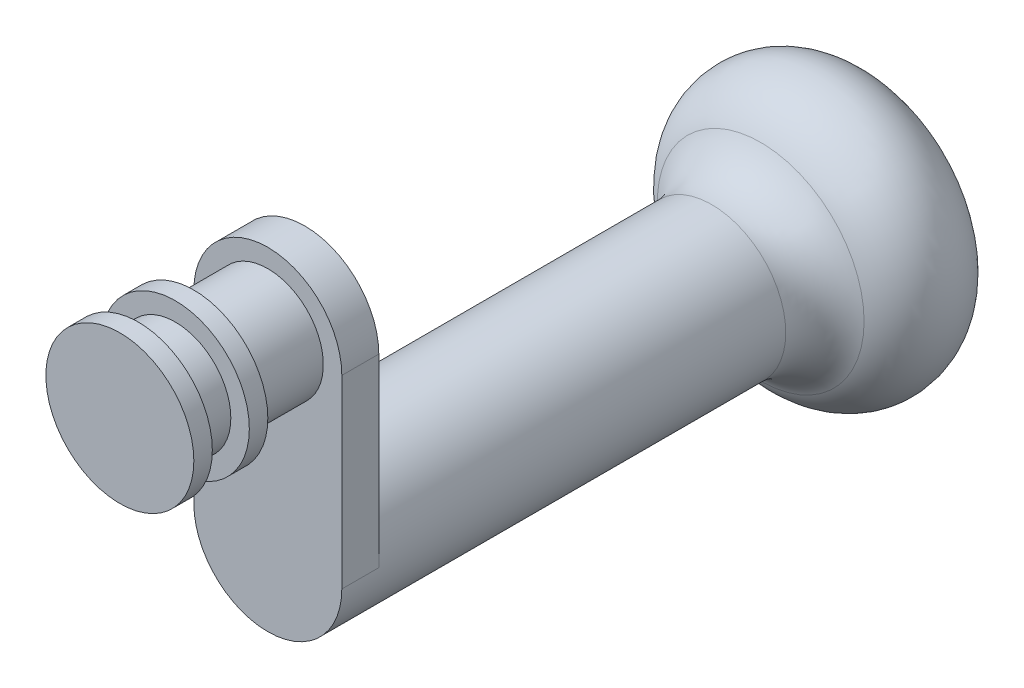
ISO-10303-21;
HEADER;
FILE_DESCRIPTION(('STEP AP214'),'2;1');
FILE_NAME('part.step','',(''),(''),'','','');
FILE_SCHEMA(('AUTOMOTIVE_DESIGN { 1 0 10303 214 1 1 1 1 }'));
ENDSEC;
DATA;
#1=APPLICATION_CONTEXT('core data for automotive mechanical design processes');
#2=APPLICATION_PROTOCOL_DEFINITION('international standard','automotive_design',2000,#1);
#3=PRODUCT_CONTEXT('',#1,'mechanical');
#4=PRODUCT('Part','Part','',(#3));
#5=PRODUCT_RELATED_PRODUCT_CATEGORY('part','',(#4));
#6=PRODUCT_DEFINITION_FORMATION('','',#4);
#7=PRODUCT_DEFINITION_CONTEXT('part definition',#1,'design');
#8=PRODUCT_DEFINITION('design','',#6,#7);
#9=PRODUCT_DEFINITION_SHAPE('','',#8);
#10=(LENGTH_UNIT() NAMED_UNIT(*) SI_UNIT(.MILLI.,.METRE.));
#11=(NAMED_UNIT(*) PLANE_ANGLE_UNIT() SI_UNIT($,.RADIAN.));
#12=(NAMED_UNIT(*) SI_UNIT($,.STERADIAN.) SOLID_ANGLE_UNIT());
#13=UNCERTAINTY_MEASURE_WITH_UNIT(LENGTH_MEASURE(1.E-05),#10,'distance_accuracy_value','');
#14=(GEOMETRIC_REPRESENTATION_CONTEXT(3) GLOBAL_UNCERTAINTY_ASSIGNED_CONTEXT((#13)) GLOBAL_UNIT_ASSIGNED_CONTEXT((#10,
#11,#12)) REPRESENTATION_CONTEXT('',''));
#15=CARTESIAN_POINT('',(0.,0.,0.));
#16=DIRECTION('',(0.,0.,1.));
#17=DIRECTION('',(1.,0.,0.));
#18=AXIS2_PLACEMENT_3D('',#15,#16,#17);
#19=CARTESIAN_POINT('',(0.,0.,25.));
#20=DIRECTION('',(0.,0.,-1.));
#21=DIRECTION('',(-1.,0.,0.));
#22=AXIS2_PLACEMENT_3D('',#19,#20,#21);
#23=CYLINDRICAL_SURFACE('',#22,7.5);
#24=CARTESIAN_POINT('',(0.,0.,15.));
#25=DIRECTION('',(0.,0.,1.));
#26=DIRECTION('',(1.,0.,0.));
#27=AXIS2_PLACEMENT_3D('',#24,#25,#26);
#28=CIRCLE('',#27,7.5);
#29=CARTESIAN_POINT('',(7.5,0.,15.));
#30=VERTEX_POINT('',#29);
#31=EDGE_CURVE('E125',#30,#30,#28,.T.);
#32=ORIENTED_EDGE('',*,*,#31,.F.);
#33=EDGE_LOOP('',(#32));
#34=FACE_BOUND('',#33,.T.);
#35=CARTESIAN_POINT('',(0.,0.,5.));
#36=DIRECTION('',(0.,0.,-1.));
#37=DIRECTION('',(-1.,0.,0.));
#38=AXIS2_PLACEMENT_3D('',#35,#36,#37);
#39=CIRCLE('',#38,7.5);
#40=CARTESIAN_POINT('',(-7.5,0.,5.));
#41=VERTEX_POINT('',#40);
#42=EDGE_CURVE('E44',#41,#41,#39,.T.);
#43=ORIENTED_EDGE('',*,*,#42,.F.);
#44=EDGE_LOOP('',(#43));
#45=FACE_BOUND('',#44,.T.);
#46=ADVANCED_FACE('F35',(#34,#45),#23,.T.);
#47=CARTESIAN_POINT('',(0.,0.,17.5));
#48=DIRECTION('',(0.,0.,1.));
#49=DIRECTION('',(1.,0.,0.));
#50=AXIS2_PLACEMENT_3D('',#47,#48,#49);
#51=CIRCLE('',#50,7.5);
#52=CARTESIAN_POINT('',(7.5,0.,17.5));
#53=VERTEX_POINT('',#52);
#54=EDGE_CURVE('E113',#53,#53,#51,.T.);
#55=ORIENTED_EDGE('',*,*,#54,.T.);
#56=EDGE_LOOP('',(#55));
#57=FACE_BOUND('',#56,.T.);
#58=CARTESIAN_POINT('',(0.,0.,22.5));
#59=DIRECTION('',(0.,0.,1.));
#60=DIRECTION('',(1.,0.,0.));
#61=AXIS2_PLACEMENT_3D('',#58,#59,#60);
#62=CIRCLE('',#61,7.5);
#63=CARTESIAN_POINT('',(7.5,0.,22.5));
#64=VERTEX_POINT('',#63);
#65=EDGE_CURVE('E119',#64,#64,#62,.T.);
#66=ORIENTED_EDGE('',*,*,#65,.F.);
#67=EDGE_LOOP('',(#66));
#68=FACE_BOUND('',#67,.T.);
#69=ADVANCED_FACE('F37',(#57,#68),#23,.T.);
#70=CARTESIAN_POINT('',(0.,0.,22.5));
#71=DIRECTION('',(0.,0.,1.));
#72=DIRECTION('',(1.,0.,0.));
#73=AXIS2_PLACEMENT_3D('',#70,#71,#72);
#74=CYLINDRICAL_SURFACE('',#73,10.);
#75=CARTESIAN_POINT('',(0.,0.,22.5));
#76=DIRECTION('',(0.,0.,1.));
#77=DIRECTION('',(1.,0.,0.));
#78=AXIS2_PLACEMENT_3D('',#75,#76,#77);
#79=CIRCLE('',#78,10.);
#80=CARTESIAN_POINT('',(10.,0.,22.5));
#81=VERTEX_POINT('',#80);
#82=EDGE_CURVE('E116',#81,#81,#79,.T.);
#83=ORIENTED_EDGE('',*,*,#82,.T.);
#84=EDGE_LOOP('',(#83));
#85=FACE_BOUND('',#84,.T.);
#86=CARTESIAN_POINT('',(0.,0.,25.));
#87=DIRECTION('',(0.,0.,1.));
#88=DIRECTION('',(1.,0.,0.));
#89=AXIS2_PLACEMENT_3D('',#86,#87,#88);
#90=CIRCLE('',#89,10.);
#91=CARTESIAN_POINT('',(10.,0.,25.));
#92=VERTEX_POINT('',#91);
#93=EDGE_CURVE('E120',#92,#92,#90,.T.);
#94=ORIENTED_EDGE('',*,*,#93,.F.);
#95=EDGE_LOOP('',(#94));
#96=FACE_BOUND('',#95,.T.);
#97=ADVANCED_FACE('F140',(#85,#96),#74,.T.);
#98=CARTESIAN_POINT('',(0.,0.,22.5));
#99=DIRECTION('',(0.,0.,1.));
#100=DIRECTION('',(1.,0.,0.));
#101=AXIS2_PLACEMENT_3D('',#98,#99,#100);
#102=PLANE('',#101);
#103=ORIENTED_EDGE('',*,*,#65,.T.);
#104=EDGE_LOOP('',(#103));
#105=FACE_BOUND('',#104,.T.);
#106=ORIENTED_EDGE('',*,*,#82,.F.);
#107=EDGE_LOOP('',(#106));
#108=FACE_BOUND('',#107,.T.);
#109=ADVANCED_FACE('F168',(#105,#108),#102,.F.);
#110=CARTESIAN_POINT('',(0.,0.,25.));
#111=DIRECTION('',(0.,0.,1.));
#112=DIRECTION('',(1.,0.,0.));
#113=AXIS2_PLACEMENT_3D('',#110,#111,#112);
#114=PLANE('',#113);
#115=ORIENTED_EDGE('',*,*,#93,.T.);
#116=EDGE_LOOP('',(#115));
#117=FACE_BOUND('',#116,.T.);
#118=ADVANCED_FACE('F154',(#117),#114,.T.);
#119=CARTESIAN_POINT('',(0.,0.,15.));
#120=DIRECTION('',(0.,0.,1.));
#121=DIRECTION('',(1.,0.,0.));
#122=AXIS2_PLACEMENT_3D('',#119,#120,#121);
#123=CYLINDRICAL_SURFACE('',#122,10.);
#124=CARTESIAN_POINT('',(0.,0.,15.));
#125=DIRECTION('',(0.,0.,1.));
#126=DIRECTION('',(1.,0.,0.));
#127=AXIS2_PLACEMENT_3D('',#124,#125,#126);
#128=CIRCLE('',#127,10.);
#129=CARTESIAN_POINT('',(10.,0.,15.));
#130=VERTEX_POINT('',#129);
#131=EDGE_CURVE('E110',#130,#130,#128,.T.);
#132=ORIENTED_EDGE('',*,*,#131,.T.);
#133=EDGE_LOOP('',(#132));
#134=FACE_BOUND('',#133,.T.);
#135=CARTESIAN_POINT('',(0.,0.,17.5));
#136=DIRECTION('',(0.,0.,1.));
#137=DIRECTION('',(1.,0.,0.));
#138=AXIS2_PLACEMENT_3D('',#135,#136,#137);
#139=CIRCLE('',#138,10.);
#140=CARTESIAN_POINT('',(10.,0.,17.5));
#141=VERTEX_POINT('',#140);
#142=EDGE_CURVE('E105',#141,#141,#139,.T.);
#143=ORIENTED_EDGE('',*,*,#142,.F.);
#144=EDGE_LOOP('',(#143));
#145=FACE_BOUND('',#144,.T.);
#146=ADVANCED_FACE('F148',(#134,#145),#123,.T.);
#147=CARTESIAN_POINT('',(0.,0.,15.));
#148=DIRECTION('',(0.,0.,1.));
#149=DIRECTION('',(1.,0.,0.));
#150=AXIS2_PLACEMENT_3D('',#147,#148,#149);
#151=PLANE('',#150);
#152=ORIENTED_EDGE('',*,*,#31,.T.);
#153=EDGE_LOOP('',(#152));
#154=FACE_BOUND('',#153,.T.);
#155=ORIENTED_EDGE('',*,*,#131,.F.);
#156=EDGE_LOOP('',(#155));
#157=FACE_BOUND('',#156,.T.);
#158=ADVANCED_FACE('F144',(#154,#157),#151,.F.);
#159=CARTESIAN_POINT('',(0.,0.,17.5));
#160=DIRECTION('',(0.,0.,1.));
#161=DIRECTION('',(1.,0.,0.));
#162=AXIS2_PLACEMENT_3D('',#159,#160,#161);
#163=PLANE('',#162);
#164=ORIENTED_EDGE('',*,*,#54,.F.);
#165=EDGE_LOOP('',(#164));
#166=FACE_BOUND('',#165,.T.);
#167=ORIENTED_EDGE('',*,*,#142,.T.);
#168=EDGE_LOOP('',(#167));
#169=FACE_BOUND('',#168,.T.);
#170=ADVANCED_FACE('F147',(#166,#169),#163,.T.);
#171=CARTESIAN_POINT('',(0.,0.,5.));
#172=DIRECTION('',(0.,0.,-1.));
#173=DIRECTION('',(-1.,0.,0.));
#174=AXIS2_PLACEMENT_3D('',#171,#172,#173);
#175=CYLINDRICAL_SURFACE('',#174,10.);
#176=CARTESIAN_POINT('',(0.,0.,0.));
#177=DIRECTION('',(0.,0.,-1.));
#178=DIRECTION('',(-1.,0.,0.));
#179=AXIS2_PLACEMENT_3D('',#176,#177,#178);
#180=CIRCLE('',#179,10.);
#181=CARTESIAN_POINT('',(-10.,0.,0.));
#182=VERTEX_POINT('',#181);
#183=CARTESIAN_POINT('',(10.,0.,0.));
#184=VERTEX_POINT('',#183);
#185=EDGE_CURVE('E99',#182,#184,#180,.T.);
#186=ORIENTED_EDGE('',*,*,#185,.F.);
#187=DIRECTION('',(0.,0.,-1.));
#188=VECTOR('',#187,1.);
#189=CARTESIAN_POINT('',(-10.,0.,5.));
#190=LINE('',#189,#188);
#191=CARTESIAN_POINT('',(-10.,0.,5.));
#192=VERTEX_POINT('',#191);
#193=EDGE_CURVE('E52',#192,#182,#190,.T.);
#194=ORIENTED_EDGE('',*,*,#193,.F.);
#195=CARTESIAN_POINT('',(0.,0.,5.));
#196=DIRECTION('',(0.,0.,-1.));
#197=DIRECTION('',(-1.,0.,0.));
#198=AXIS2_PLACEMENT_3D('',#195,#196,#197);
#199=CIRCLE('',#198,10.);
#200=CARTESIAN_POINT('',(10.,0.,5.));
#201=VERTEX_POINT('',#200);
#202=EDGE_CURVE('E87',#192,#201,#199,.T.);
#203=ORIENTED_EDGE('',*,*,#202,.T.);
#204=DIRECTION('',(0.,0.,-1.));
#205=VECTOR('',#204,1.);
#206=CARTESIAN_POINT('',(10.,0.,5.));
#207=LINE('',#206,#205);
#208=EDGE_CURVE('E76',#201,#184,#207,.T.);
#209=ORIENTED_EDGE('',*,*,#208,.T.);
#210=EDGE_LOOP('',(#186,#194,#203,#209));
#211=FACE_BOUND('',#210,.T.);
#212=ADVANCED_FACE('F159',(#211),#175,.T.);
#213=CARTESIAN_POINT('',(-10.,0.,5.));
#214=DIRECTION('',(-1.,0.,0.));
#215=DIRECTION('',(0.,-1.,0.));
#216=AXIS2_PLACEMENT_3D('',#213,#214,#215);
#217=PLANE('',#216);
#218=DIRECTION('',(0.,1.,0.));
#219=VECTOR('',#218,1.);
#220=CARTESIAN_POINT('',(-10.,0.,0.));
#221=LINE('',#220,#219);
#222=CARTESIAN_POINT('',(-10.,-25.,0.));
#223=VERTEX_POINT('',#222);
#224=EDGE_CURVE('E80',#223,#182,#221,.T.);
#225=ORIENTED_EDGE('',*,*,#224,.F.);
#226=DIRECTION('',(0.,0.,-1.));
#227=VECTOR('',#226,1.);
#228=CARTESIAN_POINT('',(-10.,-25.,5.));
#229=LINE('',#228,#227);
#230=CARTESIAN_POINT('',(-10.,-25.,5.));
#231=VERTEX_POINT('',#230);
#232=EDGE_CURVE('E83',#231,#223,#229,.T.);
#233=ORIENTED_EDGE('',*,*,#232,.F.);
#234=DIRECTION('',(0.,1.,0.));
#235=VECTOR('',#234,1.);
#236=CARTESIAN_POINT('',(-10.,0.,5.));
#237=LINE('',#236,#235);
#238=EDGE_CURVE('E109',#231,#192,#237,.T.);
#239=ORIENTED_EDGE('',*,*,#238,.T.);
#240=ORIENTED_EDGE('',*,*,#193,.T.);
#241=EDGE_LOOP('',(#225,#233,#239,#240));
#242=FACE_BOUND('',#241,.T.);
#243=ADVANCED_FACE('F82',(#242),#217,.T.);
#244=CARTESIAN_POINT('',(0.,-25.,5.));
#245=DIRECTION('',(0.,0.,-1.));
#246=DIRECTION('',(-1.,0.,0.));
#247=AXIS2_PLACEMENT_3D('',#244,#245,#246);
#248=CYLINDRICAL_SURFACE('',#247,10.);
#249=ORIENTED_EDGE('',*,*,#232,.T.);
#250=CARTESIAN_POINT('',(0.,-25.,0.));
#251=DIRECTION('',(0.,0.,1.));
#252=DIRECTION('',(1.,0.,0.));
#253=AXIS2_PLACEMENT_3D('',#250,#251,#252);
#254=CIRCLE('',#253,10.);
#255=CARTESIAN_POINT('',(10.,-25.,0.));
#256=VERTEX_POINT('',#255);
#257=EDGE_CURVE('E11',#256,#223,#254,.T.);
#258=ORIENTED_EDGE('',*,*,#257,.F.);
#259=DIRECTION('',(0.,0.,-1.));
#260=VECTOR('',#259,1.);
#261=CARTESIAN_POINT('',(10.,-25.,5.));
#262=LINE('',#261,#260);
#263=CARTESIAN_POINT('',(10.,-25.,5.));
#264=VERTEX_POINT('',#263);
#265=EDGE_CURVE('E68',#264,#256,#262,.T.);
#266=ORIENTED_EDGE('',*,*,#265,.F.);
#267=CARTESIAN_POINT('',(0.,-25.,5.));
#268=DIRECTION('',(0.,0.,-1.));
#269=DIRECTION('',(-1.,0.,0.));
#270=AXIS2_PLACEMENT_3D('',#267,#268,#269);
#271=CIRCLE('',#270,10.);
#272=EDGE_CURVE('E95',#264,#231,#271,.T.);
#273=ORIENTED_EDGE('',*,*,#272,.T.);
#274=EDGE_LOOP('',(#249,#258,#266,#273));
#275=FACE_BOUND('',#274,.T.);
#276=CARTESIAN_POINT('',(0.,-25.,-55.));
#277=DIRECTION('',(0.,0.,1.));
#278=DIRECTION('',(1.,0.,0.));
#279=AXIS2_PLACEMENT_3D('',#276,#277,#278);
#280=CIRCLE('',#279,10.);
#281=CARTESIAN_POINT('',(10.,-25.,-55.));
#282=VERTEX_POINT('',#281);
#283=EDGE_CURVE('E101',#282,#282,#280,.T.);
#284=ORIENTED_EDGE('',*,*,#283,.T.);
#285=EDGE_LOOP('',(#284));
#286=FACE_BOUND('',#285,.T.);
#287=ADVANCED_FACE('F92',(#275,#286),#248,.T.);
#288=CARTESIAN_POINT('',(10.,0.,5.));
#289=DIRECTION('',(1.,0.,0.));
#290=DIRECTION('',(0.,1.,0.));
#291=AXIS2_PLACEMENT_3D('',#288,#289,#290);
#292=PLANE('',#291);
#293=DIRECTION('',(0.,-1.,0.));
#294=VECTOR('',#293,1.);
#295=CARTESIAN_POINT('',(10.,0.,0.));
#296=LINE('',#295,#294);
#297=EDGE_CURVE('E88',#184,#256,#296,.T.);
#298=ORIENTED_EDGE('',*,*,#297,.F.);
#299=ORIENTED_EDGE('',*,*,#208,.F.);
#300=DIRECTION('',(0.,-1.,0.));
#301=VECTOR('',#300,1.);
#302=CARTESIAN_POINT('',(10.,0.,5.));
#303=LINE('',#302,#301);
#304=EDGE_CURVE('E269',#201,#264,#303,.T.);
#305=ORIENTED_EDGE('',*,*,#304,.T.);
#306=ORIENTED_EDGE('',*,*,#265,.T.);
#307=EDGE_LOOP('',(#298,#299,#305,#306));
#308=FACE_BOUND('',#307,.T.);
#309=ADVANCED_FACE('F186',(#308),#292,.T.);
#310=CARTESIAN_POINT('',(0.,0.,5.));
#311=DIRECTION('',(0.,0.,-1.));
#312=DIRECTION('',(-1.,0.,0.));
#313=AXIS2_PLACEMENT_3D('',#310,#311,#312);
#314=PLANE('',#313);
#315=ORIENTED_EDGE('',*,*,#42,.T.);
#316=EDGE_LOOP('',(#315));
#317=FACE_BOUND('',#316,.T.);
#318=ORIENTED_EDGE('',*,*,#238,.F.);
#319=ORIENTED_EDGE('',*,*,#272,.F.);
#320=ORIENTED_EDGE('',*,*,#304,.F.);
#321=ORIENTED_EDGE('',*,*,#202,.F.);
#322=EDGE_LOOP('',(#318,#319,#320,#321));
#323=FACE_BOUND('',#322,.T.);
#324=ADVANCED_FACE('F132',(#317,#323),#314,.F.);
#325=CARTESIAN_POINT('',(0.,0.,0.));
#326=DIRECTION('',(0.,0.,1.));
#327=DIRECTION('',(1.,0.,0.));
#328=AXIS2_PLACEMENT_3D('',#325,#326,#327);
#329=PLANE('',#328);
#330=ORIENTED_EDGE('',*,*,#297,.T.);
#331=ORIENTED_EDGE('',*,*,#257,.T.);
#332=ORIENTED_EDGE('',*,*,#224,.T.);
#333=ORIENTED_EDGE('',*,*,#185,.T.);
#334=EDGE_LOOP('',(#330,#331,#332,#333));
#335=FACE_BOUND('',#334,.T.);
#336=ADVANCED_FACE('F98',(#335),#329,.F.);
#337=CARTESIAN_POINT('',(0.,-25.,-55.));
#338=DIRECTION('',(0.,0.,1.));
#339=DIRECTION('',(1.,0.,0.));
#340=AXIS2_PLACEMENT_3D('',#337,#338,#339);
#341=TOROIDAL_SURFACE('',#340,17.5,7.5);
#342=ORIENTED_EDGE('',*,*,#283,.F.);
#343=EDGE_LOOP('',(#342));
#344=FACE_BOUND('',#343,.T.);
#345=CARTESIAN_POINT('',(0.,-25.,-61.6176470588235));
#346=DIRECTION('',(0.,0.,1.));
#347=DIRECTION('',(1.,0.,0.));
#348=AXIS2_PLACEMENT_3D('',#345,#346,#347);
#349=CIRCLE('',#348,13.9705882352941);
#350=CARTESIAN_POINT('',(13.9705882352941,-25.,-61.6176470588235));
#351=VERTEX_POINT('',#350);
#352=EDGE_CURVE('E261',#351,#351,#349,.T.);
#353=ORIENTED_EDGE('',*,*,#352,.T.);
#354=EDGE_LOOP('',(#353));
#355=FACE_BOUND('',#354,.T.);
#356=ADVANCED_FACE('F178',(#344,#355),#341,.F.);
#357=CARTESIAN_POINT('',(0.,-25.,-69.0625));
#358=DIRECTION('',(0.,0.,1.));
#359=DIRECTION('',(1.,0.,0.));
#360=AXIS2_PLACEMENT_3D('',#357,#358,#359);
#361=TOROIDAL_SURFACE('',#360,10.,8.43750000000001);
#362=ORIENTED_EDGE('',*,*,#352,.F.);
#363=EDGE_LOOP('',(#362));
#364=FACE_BOUND('',#363,.T.);
#365=CARTESIAN_POINT('',(0.,-25.,-77.5));
#366=DIRECTION('',(0.,0.,1.));
#367=DIRECTION('',(1.,0.,0.));
#368=AXIS2_PLACEMENT_3D('',#365,#366,#367);
#369=CIRCLE('',#368,10.);
#370=CARTESIAN_POINT('',(10.,-25.,-77.5));
#371=VERTEX_POINT('',#370);
#372=EDGE_CURVE('E259',#371,#371,#369,.T.);
#373=ORIENTED_EDGE('',*,*,#372,.T.);
#374=EDGE_LOOP('',(#373));
#375=FACE_BOUND('',#374,.T.);
#376=ADVANCED_FACE('F183',(#364,#375),#361,.T.);
#377=CARTESIAN_POINT('',(0.,-15.,-77.5));
#378=DIRECTION('',(0.,0.,1.));
#379=DIRECTION('',(1.,0.,0.));
#380=AXIS2_PLACEMENT_3D('',#377,#378,#379);
#381=PLANE('',#380);
#382=ORIENTED_EDGE('',*,*,#372,.F.);
#383=EDGE_LOOP('',(#382));
#384=FACE_BOUND('',#383,.T.);
#385=ADVANCED_FACE('F244',(#384),#381,.F.);
#386=CLOSED_SHELL('',(#46,#69,#97,#109,#118,#146,#158,#170,#212,#243,#287,#309,#324,#336,#356,
#376,#385));
#387=MANIFOLD_SOLID_BREP('B2',#386);
#388=ADVANCED_BREP_SHAPE_REPRESENTATION('',(#18,#387),#14);
#389=SHAPE_DEFINITION_REPRESENTATION(#9,#388);
ENDSEC;
END-ISO-10303-21;
